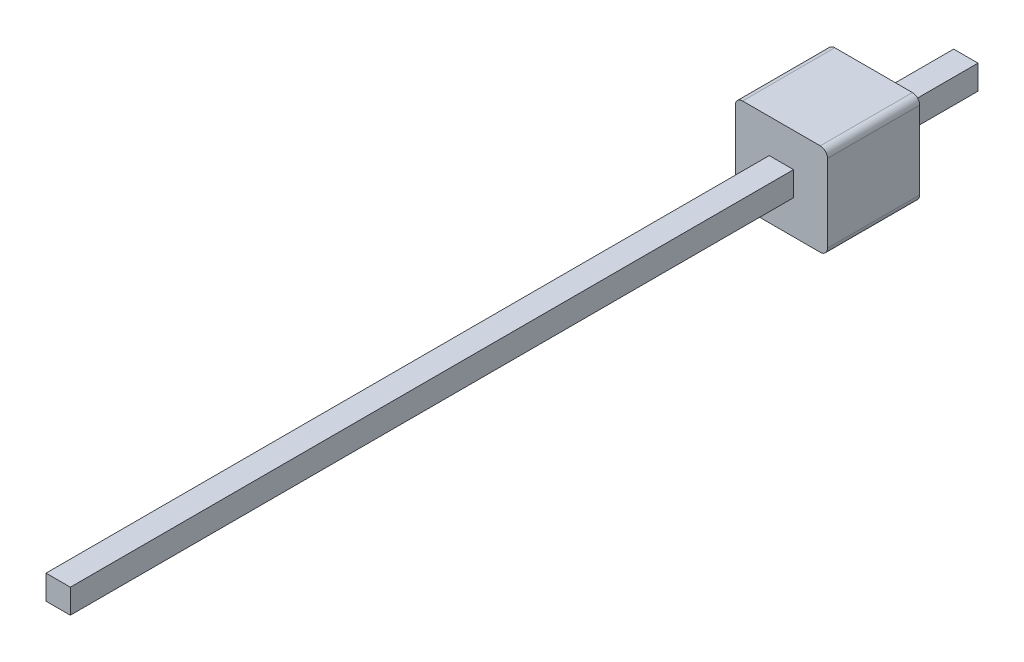
ISO-10303-21;
HEADER;
FILE_DESCRIPTION(('STEP AP214'),'2;1');
FILE_NAME('part.step','',(''),(''),'','','');
FILE_SCHEMA(('AUTOMOTIVE_DESIGN { 1 0 10303 214 1 1 1 1 }'));
ENDSEC;
DATA;
#1=APPLICATION_CONTEXT('core data for automotive mechanical design processes');
#2=APPLICATION_PROTOCOL_DEFINITION('international standard','automotive_design',2000,#1);
#3=PRODUCT_CONTEXT('',#1,'mechanical');
#4=PRODUCT('Part','Part','',(#3));
#5=PRODUCT_RELATED_PRODUCT_CATEGORY('part','',(#4));
#6=PRODUCT_DEFINITION_FORMATION('','',#4);
#7=PRODUCT_DEFINITION_CONTEXT('part definition',#1,'design');
#8=PRODUCT_DEFINITION('design','',#6,#7);
#9=PRODUCT_DEFINITION_SHAPE('','',#8);
#10=(LENGTH_UNIT() NAMED_UNIT(*) SI_UNIT(.MILLI.,.METRE.));
#11=(NAMED_UNIT(*) PLANE_ANGLE_UNIT() SI_UNIT($,.RADIAN.));
#12=(NAMED_UNIT(*) SI_UNIT($,.STERADIAN.) SOLID_ANGLE_UNIT());
#13=UNCERTAINTY_MEASURE_WITH_UNIT(LENGTH_MEASURE(1.E-05),#10,'distance_accuracy_value','');
#14=(GEOMETRIC_REPRESENTATION_CONTEXT(3) GLOBAL_UNCERTAINTY_ASSIGNED_CONTEXT((#13)) GLOBAL_UNIT_ASSIGNED_CONTEXT((#10,
#11,#12)) REPRESENTATION_CONTEXT('',''));
#15=CARTESIAN_POINT('',(0.,0.,0.));
#16=DIRECTION('',(0.,0.,1.));
#17=DIRECTION('',(1.,0.,0.));
#18=AXIS2_PLACEMENT_3D('',#15,#16,#17);
#19=CARTESIAN_POINT('',(-1.27,-1.27,2.54));
#20=DIRECTION('',(0.,0.,1.));
#21=DIRECTION('',(1.,0.,0.));
#22=AXIS2_PLACEMENT_3D('',#19,#20,#21);
#23=PLANE('',#22);
#24=DIRECTION('',(-1.,0.,0.));
#25=VECTOR('',#24,1.);
#26=CARTESIAN_POINT('',(-1.27,1.27,2.54));
#27=LINE('',#26,#25);
#28=CARTESIAN_POINT('',(1.07,1.27,2.54));
#29=VERTEX_POINT('',#28);
#30=CARTESIAN_POINT('',(-1.07,1.27,2.54));
#31=VERTEX_POINT('',#30);
#32=EDGE_CURVE('E230',#29,#31,#27,.T.);
#33=ORIENTED_EDGE('',*,*,#32,.T.);
#34=CARTESIAN_POINT('',(-1.07,1.07,2.54));
#35=DIRECTION('',(0.,0.,1.));
#36=DIRECTION('',(1.,0.,0.));
#37=AXIS2_PLACEMENT_3D('',#34,#35,#36);
#38=CIRCLE('',#37,0.2);
#39=CARTESIAN_POINT('',(-1.27,1.07,2.54));
#40=VERTEX_POINT('',#39);
#41=EDGE_CURVE('E265',#31,#40,#38,.T.);
#42=ORIENTED_EDGE('',*,*,#41,.T.);
#43=DIRECTION('',(0.,-1.,0.));
#44=VECTOR('',#43,1.);
#45=CARTESIAN_POINT('',(-1.27,1.27,2.54));
#46=LINE('',#45,#44);
#47=CARTESIAN_POINT('',(-1.27,-1.07,2.54));
#48=VERTEX_POINT('',#47);
#49=EDGE_CURVE('E222',#40,#48,#46,.T.);
#50=ORIENTED_EDGE('',*,*,#49,.T.);
#51=CARTESIAN_POINT('',(-1.07,-1.07,2.54));
#52=DIRECTION('',(0.,0.,1.));
#53=DIRECTION('',(1.,0.,0.));
#54=AXIS2_PLACEMENT_3D('',#51,#52,#53);
#55=CIRCLE('',#54,0.2);
#56=CARTESIAN_POINT('',(-1.07,-1.27,2.54));
#57=VERTEX_POINT('',#56);
#58=EDGE_CURVE('E263',#48,#57,#55,.T.);
#59=ORIENTED_EDGE('',*,*,#58,.T.);
#60=DIRECTION('',(1.,0.,0.));
#61=VECTOR('',#60,1.);
#62=CARTESIAN_POINT('',(-1.27,-1.27,2.54));
#63=LINE('',#62,#61);
#64=CARTESIAN_POINT('',(1.07,-1.27,2.54));
#65=VERTEX_POINT('',#64);
#66=EDGE_CURVE('E225',#57,#65,#63,.T.);
#67=ORIENTED_EDGE('',*,*,#66,.T.);
#68=CARTESIAN_POINT('',(1.07,-1.07,2.54));
#69=DIRECTION('',(0.,0.,1.));
#70=DIRECTION('',(1.,0.,0.));
#71=AXIS2_PLACEMENT_3D('',#68,#69,#70);
#72=CIRCLE('',#71,0.2);
#73=CARTESIAN_POINT('',(1.27,-1.07,2.54));
#74=VERTEX_POINT('',#73);
#75=EDGE_CURVE('E56',#65,#74,#72,.T.);
#76=ORIENTED_EDGE('',*,*,#75,.T.);
#77=DIRECTION('',(0.,1.,0.));
#78=VECTOR('',#77,1.);
#79=CARTESIAN_POINT('',(1.27,1.27,2.54));
#80=LINE('',#79,#78);
#81=CARTESIAN_POINT('',(1.27,1.07,2.54));
#82=VERTEX_POINT('',#81);
#83=EDGE_CURVE('E228',#74,#82,#80,.T.);
#84=ORIENTED_EDGE('',*,*,#83,.T.);
#85=CARTESIAN_POINT('',(1.07,1.07,2.54));
#86=DIRECTION('',(0.,0.,1.));
#87=DIRECTION('',(1.,0.,0.));
#88=AXIS2_PLACEMENT_3D('',#85,#86,#87);
#89=CIRCLE('',#88,0.2);
#90=EDGE_CURVE('E260',#82,#29,#89,.T.);
#91=ORIENTED_EDGE('',*,*,#90,.T.);
#92=EDGE_LOOP('',(#33,#42,#50,#59,#67,#76,#84,#91));
#93=FACE_BOUND('',#92,.T.);
#94=DIRECTION('',(0.,-1.,0.));
#95=VECTOR('',#94,1.);
#96=CARTESIAN_POINT('',(-0.335,-0.335,2.54));
#97=LINE('',#96,#95);
#98=CARTESIAN_POINT('',(-0.335,0.335,2.54));
#99=VERTEX_POINT('',#98);
#100=CARTESIAN_POINT('',(-0.335,-0.335,2.54));
#101=VERTEX_POINT('',#100);
#102=EDGE_CURVE('E165',#99,#101,#97,.T.);
#103=ORIENTED_EDGE('',*,*,#102,.F.);
#104=DIRECTION('',(-1.,0.,0.));
#105=VECTOR('',#104,1.);
#106=CARTESIAN_POINT('',(0.335,0.335,2.54));
#107=LINE('',#106,#105);
#108=CARTESIAN_POINT('',(0.335,0.335,2.54));
#109=VERTEX_POINT('',#108);
#110=EDGE_CURVE('E175',#109,#99,#107,.T.);
#111=ORIENTED_EDGE('',*,*,#110,.F.);
#112=DIRECTION('',(0.,1.,0.));
#113=VECTOR('',#112,1.);
#114=CARTESIAN_POINT('',(0.335,-0.335,2.54));
#115=LINE('',#114,#113);
#116=CARTESIAN_POINT('',(0.335,-0.335,2.54));
#117=VERTEX_POINT('',#116);
#118=EDGE_CURVE('E173',#117,#109,#115,.T.);
#119=ORIENTED_EDGE('',*,*,#118,.F.);
#120=DIRECTION('',(1.,0.,0.));
#121=VECTOR('',#120,1.);
#122=CARTESIAN_POINT('',(0.335,-0.335,2.54));
#123=LINE('',#122,#121);
#124=EDGE_CURVE('E155',#101,#117,#123,.T.);
#125=ORIENTED_EDGE('',*,*,#124,.F.);
#126=EDGE_LOOP('',(#103,#111,#119,#125));
#127=FACE_BOUND('',#126,.T.);
#128=ADVANCED_FACE('F35',(#93,#127),#23,.T.);
#129=CARTESIAN_POINT('',(-1.27,-1.27,0.));
#130=DIRECTION('',(0.,0.,1.));
#131=DIRECTION('',(1.,0.,0.));
#132=AXIS2_PLACEMENT_3D('',#129,#130,#131);
#133=PLANE('',#132);
#134=DIRECTION('',(0.,-1.,0.));
#135=VECTOR('',#134,1.);
#136=CARTESIAN_POINT('',(-1.27,1.27,0.));
#137=LINE('',#136,#135);
#138=CARTESIAN_POINT('',(-1.27,1.07,0.));
#139=VERTEX_POINT('',#138);
#140=CARTESIAN_POINT('',(-1.27,-1.07,0.));
#141=VERTEX_POINT('',#140);
#142=EDGE_CURVE('E221',#139,#141,#137,.T.);
#143=ORIENTED_EDGE('',*,*,#142,.F.);
#144=CARTESIAN_POINT('',(-1.07,1.07,0.));
#145=DIRECTION('',(0.,0.,1.));
#146=DIRECTION('',(1.,0.,0.));
#147=AXIS2_PLACEMENT_3D('',#144,#145,#146);
#148=CIRCLE('',#147,0.2);
#149=CARTESIAN_POINT('',(-1.07,1.27,0.));
#150=VERTEX_POINT('',#149);
#151=EDGE_CURVE('E253',#139,#150,#148,.F.);
#152=ORIENTED_EDGE('',*,*,#151,.T.);
#153=DIRECTION('',(-1.,0.,0.));
#154=VECTOR('',#153,1.);
#155=CARTESIAN_POINT('',(-1.27,1.27,0.));
#156=LINE('',#155,#154);
#157=CARTESIAN_POINT('',(1.07,1.27,0.));
#158=VERTEX_POINT('',#157);
#159=EDGE_CURVE('E226',#158,#150,#156,.T.);
#160=ORIENTED_EDGE('',*,*,#159,.F.);
#161=CARTESIAN_POINT('',(1.07,1.07,0.));
#162=DIRECTION('',(0.,0.,1.));
#163=DIRECTION('',(1.,0.,0.));
#164=AXIS2_PLACEMENT_3D('',#161,#162,#163);
#165=CIRCLE('',#164,0.2);
#166=CARTESIAN_POINT('',(1.27,1.07,0.));
#167=VERTEX_POINT('',#166);
#168=EDGE_CURVE('E247',#158,#167,#165,.F.);
#169=ORIENTED_EDGE('',*,*,#168,.T.);
#170=DIRECTION('',(0.,1.,0.));
#171=VECTOR('',#170,1.);
#172=CARTESIAN_POINT('',(1.27,1.27,0.));
#173=LINE('',#172,#171);
#174=CARTESIAN_POINT('',(1.27,-1.07,0.));
#175=VERTEX_POINT('',#174);
#176=EDGE_CURVE('E239',#175,#167,#173,.T.);
#177=ORIENTED_EDGE('',*,*,#176,.F.);
#178=CARTESIAN_POINT('',(1.07,-1.07,0.));
#179=DIRECTION('',(0.,0.,1.));
#180=DIRECTION('',(1.,0.,0.));
#181=AXIS2_PLACEMENT_3D('',#178,#179,#180);
#182=CIRCLE('',#181,0.2);
#183=CARTESIAN_POINT('',(1.07,-1.27,0.));
#184=VERTEX_POINT('',#183);
#185=EDGE_CURVE('E249',#175,#184,#182,.F.);
#186=ORIENTED_EDGE('',*,*,#185,.T.);
#187=DIRECTION('',(1.,0.,0.));
#188=VECTOR('',#187,1.);
#189=CARTESIAN_POINT('',(-1.27,-1.27,0.));
#190=LINE('',#189,#188);
#191=CARTESIAN_POINT('',(-1.07,-1.27,0.));
#192=VERTEX_POINT('',#191);
#193=EDGE_CURVE('E236',#192,#184,#190,.T.);
#194=ORIENTED_EDGE('',*,*,#193,.F.);
#195=CARTESIAN_POINT('',(-1.07,-1.07,0.));
#196=DIRECTION('',(0.,0.,1.));
#197=DIRECTION('',(1.,0.,0.));
#198=AXIS2_PLACEMENT_3D('',#195,#196,#197);
#199=CIRCLE('',#198,0.2);
#200=EDGE_CURVE('E251',#192,#141,#199,.F.);
#201=ORIENTED_EDGE('',*,*,#200,.T.);
#202=EDGE_LOOP('',(#143,#152,#160,#169,#177,#186,#194,#201));
#203=FACE_BOUND('',#202,.T.);
#204=DIRECTION('',(0.,-1.,0.));
#205=VECTOR('',#204,1.);
#206=CARTESIAN_POINT('',(0.335,-0.335,0.));
#207=LINE('',#206,#205);
#208=CARTESIAN_POINT('',(0.335,0.335,0.));
#209=VERTEX_POINT('',#208);
#210=CARTESIAN_POINT('',(0.335,-0.335,0.));
#211=VERTEX_POINT('',#210);
#212=EDGE_CURVE('E198',#209,#211,#207,.T.);
#213=ORIENTED_EDGE('',*,*,#212,.F.);
#214=DIRECTION('',(1.,0.,0.));
#215=VECTOR('',#214,1.);
#216=CARTESIAN_POINT('',(-0.335,0.335,0.));
#217=LINE('',#216,#215);
#218=CARTESIAN_POINT('',(-0.335,0.335,0.));
#219=VERTEX_POINT('',#218);
#220=EDGE_CURVE('E191',#219,#209,#217,.T.);
#221=ORIENTED_EDGE('',*,*,#220,.F.);
#222=DIRECTION('',(0.,1.,0.));
#223=VECTOR('',#222,1.);
#224=CARTESIAN_POINT('',(-0.335,-0.335,0.));
#225=LINE('',#224,#223);
#226=CARTESIAN_POINT('',(-0.335,-0.335,0.));
#227=VERTEX_POINT('',#226);
#228=EDGE_CURVE('E205',#227,#219,#225,.T.);
#229=ORIENTED_EDGE('',*,*,#228,.F.);
#230=DIRECTION('',(-1.,0.,0.));
#231=VECTOR('',#230,1.);
#232=CARTESIAN_POINT('',(-0.335,-0.335,0.));
#233=LINE('',#232,#231);
#234=EDGE_CURVE('E201',#211,#227,#233,.T.);
#235=ORIENTED_EDGE('',*,*,#234,.F.);
#236=EDGE_LOOP('',(#213,#221,#229,#235));
#237=FACE_BOUND('',#236,.T.);
#238=ADVANCED_FACE('F281',(#203,#237),#133,.F.);
#239=CARTESIAN_POINT('',(-1.27,1.27,2.54));
#240=DIRECTION('',(1.,0.,0.));
#241=DIRECTION('',(0.,0.,-1.));
#242=AXIS2_PLACEMENT_3D('',#239,#240,#241);
#243=PLANE('',#242);
#244=ORIENTED_EDGE('',*,*,#49,.F.);
#245=DIRECTION('',(0.,0.,-1.));
#246=VECTOR('',#245,1.);
#247=CARTESIAN_POINT('',(-1.27,1.07,2.54));
#248=LINE('',#247,#246);
#249=EDGE_CURVE('E244',#40,#139,#248,.T.);
#250=ORIENTED_EDGE('',*,*,#249,.T.);
#251=ORIENTED_EDGE('',*,*,#142,.T.);
#252=DIRECTION('',(0.,0.,-1.));
#253=VECTOR('',#252,1.);
#254=CARTESIAN_POINT('',(-1.27,-1.07,2.54));
#255=LINE('',#254,#253);
#256=EDGE_CURVE('E233',#141,#48,#255,.F.);
#257=ORIENTED_EDGE('',*,*,#256,.T.);
#258=EDGE_LOOP('',(#244,#250,#251,#257));
#259=FACE_BOUND('',#258,.T.);
#260=ADVANCED_FACE('F302',(#259),#243,.F.);
#261=CARTESIAN_POINT('',(-1.27,-1.27,2.54));
#262=DIRECTION('',(0.,1.,0.));
#263=DIRECTION('',(-1.,0.,0.));
#264=AXIS2_PLACEMENT_3D('',#261,#262,#263);
#265=PLANE('',#264);
#266=ORIENTED_EDGE('',*,*,#66,.F.);
#267=DIRECTION('',(0.,0.,-1.));
#268=VECTOR('',#267,1.);
#269=CARTESIAN_POINT('',(-1.07,-1.27,2.54));
#270=LINE('',#269,#268);
#271=EDGE_CURVE('E269',#57,#192,#270,.T.);
#272=ORIENTED_EDGE('',*,*,#271,.T.);
#273=ORIENTED_EDGE('',*,*,#193,.T.);
#274=DIRECTION('',(0.,0.,-1.));
#275=VECTOR('',#274,1.);
#276=CARTESIAN_POINT('',(1.07,-1.27,2.54));
#277=LINE('',#276,#275);
#278=EDGE_CURVE('E267',#184,#65,#277,.F.);
#279=ORIENTED_EDGE('',*,*,#278,.T.);
#280=EDGE_LOOP('',(#266,#272,#273,#279));
#281=FACE_BOUND('',#280,.T.);
#282=ADVANCED_FACE('F275',(#281),#265,.F.);
#283=CARTESIAN_POINT('',(1.27,1.27,2.54));
#284=DIRECTION('',(-1.,0.,0.));
#285=DIRECTION('',(0.,-1.,0.));
#286=AXIS2_PLACEMENT_3D('',#283,#284,#285);
#287=PLANE('',#286);
#288=ORIENTED_EDGE('',*,*,#83,.F.);
#289=DIRECTION('',(0.,0.,-1.));
#290=VECTOR('',#289,1.);
#291=CARTESIAN_POINT('',(1.27,-1.07,2.54));
#292=LINE('',#291,#290);
#293=EDGE_CURVE('E12',#74,#175,#292,.T.);
#294=ORIENTED_EDGE('',*,*,#293,.T.);
#295=ORIENTED_EDGE('',*,*,#176,.T.);
#296=DIRECTION('',(0.,0.,-1.));
#297=VECTOR('',#296,1.);
#298=CARTESIAN_POINT('',(1.27,1.07,2.54));
#299=LINE('',#298,#297);
#300=EDGE_CURVE('E43',#167,#82,#299,.F.);
#301=ORIENTED_EDGE('',*,*,#300,.T.);
#302=EDGE_LOOP('',(#288,#294,#295,#301));
#303=FACE_BOUND('',#302,.T.);
#304=ADVANCED_FACE('F287',(#303),#287,.F.);
#305=CARTESIAN_POINT('',(-1.27,1.27,2.54));
#306=DIRECTION('',(0.,-1.,0.));
#307=DIRECTION('',(1.,0.,0.));
#308=AXIS2_PLACEMENT_3D('',#305,#306,#307);
#309=PLANE('',#308);
#310=ORIENTED_EDGE('',*,*,#159,.T.);
#311=DIRECTION('',(0.,0.,-1.));
#312=VECTOR('',#311,1.);
#313=CARTESIAN_POINT('',(-1.07,1.27,2.54));
#314=LINE('',#313,#312);
#315=EDGE_CURVE('E258',#150,#31,#314,.F.);
#316=ORIENTED_EDGE('',*,*,#315,.T.);
#317=ORIENTED_EDGE('',*,*,#32,.F.);
#318=DIRECTION('',(0.,0.,-1.));
#319=VECTOR('',#318,1.);
#320=CARTESIAN_POINT('',(1.07,1.27,2.54));
#321=LINE('',#320,#319);
#322=EDGE_CURVE('E255',#29,#158,#321,.T.);
#323=ORIENTED_EDGE('',*,*,#322,.T.);
#324=EDGE_LOOP('',(#310,#316,#317,#323));
#325=FACE_BOUND('',#324,.T.);
#326=ADVANCED_FACE('F294',(#325),#309,.F.);
#327=CARTESIAN_POINT('',(0.335,-0.335,-2.54));
#328=DIRECTION('',(-1.,0.,0.));
#329=DIRECTION('',(0.,0.,1.));
#330=AXIS2_PLACEMENT_3D('',#327,#328,#329);
#331=PLANE('',#330);
#332=ORIENTED_EDGE('',*,*,#212,.T.);
#333=DIRECTION('',(0.,0.,1.));
#334=VECTOR('',#333,1.);
#335=CARTESIAN_POINT('',(0.335,-0.335,-2.54));
#336=LINE('',#335,#334);
#337=CARTESIAN_POINT('',(0.335,-0.335,-2.54));
#338=VERTEX_POINT('',#337);
#339=EDGE_CURVE('E218',#338,#211,#336,.T.);
#340=ORIENTED_EDGE('',*,*,#339,.F.);
#341=DIRECTION('',(0.,-1.,0.));
#342=VECTOR('',#341,1.);
#343=CARTESIAN_POINT('',(0.335,-0.335,-2.54));
#344=LINE('',#343,#342);
#345=CARTESIAN_POINT('',(0.335,0.335,-2.54));
#346=VERTEX_POINT('',#345);
#347=EDGE_CURVE('E187',#346,#338,#344,.T.);
#348=ORIENTED_EDGE('',*,*,#347,.F.);
#349=DIRECTION('',(0.,0.,1.));
#350=VECTOR('',#349,1.);
#351=CARTESIAN_POINT('',(0.335,0.335,-2.54));
#352=LINE('',#351,#350);
#353=EDGE_CURVE('E197',#346,#209,#352,.T.);
#354=ORIENTED_EDGE('',*,*,#353,.T.);
#355=EDGE_LOOP('',(#332,#340,#348,#354));
#356=FACE_BOUND('',#355,.T.);
#357=ADVANCED_FACE('F321',(#356),#331,.F.);
#358=CARTESIAN_POINT('',(-0.335,-0.335,-2.54));
#359=DIRECTION('',(0.,1.,0.));
#360=DIRECTION('',(-1.,0.,0.));
#361=AXIS2_PLACEMENT_3D('',#358,#359,#360);
#362=PLANE('',#361);
#363=ORIENTED_EDGE('',*,*,#234,.T.);
#364=DIRECTION('',(0.,0.,1.));
#365=VECTOR('',#364,1.);
#366=CARTESIAN_POINT('',(-0.335,-0.335,-2.54));
#367=LINE('',#366,#365);
#368=CARTESIAN_POINT('',(-0.335,-0.335,-2.54));
#369=VERTEX_POINT('',#368);
#370=EDGE_CURVE('E215',#369,#227,#367,.T.);
#371=ORIENTED_EDGE('',*,*,#370,.F.);
#372=DIRECTION('',(-1.,0.,0.));
#373=VECTOR('',#372,1.);
#374=CARTESIAN_POINT('',(-0.335,-0.335,-2.54));
#375=LINE('',#374,#373);
#376=EDGE_CURVE('E190',#338,#369,#375,.T.);
#377=ORIENTED_EDGE('',*,*,#376,.F.);
#378=ORIENTED_EDGE('',*,*,#339,.T.);
#379=EDGE_LOOP('',(#363,#371,#377,#378));
#380=FACE_BOUND('',#379,.T.);
#381=ADVANCED_FACE('F428',(#380),#362,.F.);
#382=CARTESIAN_POINT('',(-0.335,-0.335,-2.54));
#383=DIRECTION('',(1.,0.,0.));
#384=DIRECTION('',(0.,0.,-1.));
#385=AXIS2_PLACEMENT_3D('',#382,#383,#384);
#386=PLANE('',#385);
#387=ORIENTED_EDGE('',*,*,#228,.T.);
#388=DIRECTION('',(0.,0.,1.));
#389=VECTOR('',#388,1.);
#390=CARTESIAN_POINT('',(-0.335,0.335,-2.54));
#391=LINE('',#390,#389);
#392=CARTESIAN_POINT('',(-0.335,0.335,-2.54));
#393=VERTEX_POINT('',#392);
#394=EDGE_CURVE('E212',#393,#219,#391,.T.);
#395=ORIENTED_EDGE('',*,*,#394,.F.);
#396=DIRECTION('',(0.,1.,0.));
#397=VECTOR('',#396,1.);
#398=CARTESIAN_POINT('',(-0.335,-0.335,-2.54));
#399=LINE('',#398,#397);
#400=EDGE_CURVE('E193',#369,#393,#399,.T.);
#401=ORIENTED_EDGE('',*,*,#400,.F.);
#402=ORIENTED_EDGE('',*,*,#370,.T.);
#403=EDGE_LOOP('',(#387,#395,#401,#402));
#404=FACE_BOUND('',#403,.T.);
#405=ADVANCED_FACE('F420',(#404),#386,.F.);
#406=CARTESIAN_POINT('',(-0.335,0.335,-2.54));
#407=DIRECTION('',(0.,-1.,0.));
#408=DIRECTION('',(1.,0.,0.));
#409=AXIS2_PLACEMENT_3D('',#406,#407,#408);
#410=PLANE('',#409);
#411=ORIENTED_EDGE('',*,*,#220,.T.);
#412=ORIENTED_EDGE('',*,*,#353,.F.);
#413=DIRECTION('',(1.,0.,0.));
#414=VECTOR('',#413,1.);
#415=CARTESIAN_POINT('',(-0.335,0.335,-2.54));
#416=LINE('',#415,#414);
#417=EDGE_CURVE('E195',#393,#346,#416,.T.);
#418=ORIENTED_EDGE('',*,*,#417,.F.);
#419=ORIENTED_EDGE('',*,*,#394,.T.);
#420=EDGE_LOOP('',(#411,#412,#418,#419));
#421=FACE_BOUND('',#420,.T.);
#422=ADVANCED_FACE('F412',(#421),#410,.F.);
#423=CARTESIAN_POINT('',(0.,0.,-2.54));
#424=DIRECTION('',(0.,0.,-1.));
#425=DIRECTION('',(-1.,0.,0.));
#426=AXIS2_PLACEMENT_3D('',#423,#424,#425);
#427=PLANE('',#426);
#428=ORIENTED_EDGE('',*,*,#347,.T.);
#429=ORIENTED_EDGE('',*,*,#376,.T.);
#430=ORIENTED_EDGE('',*,*,#400,.T.);
#431=ORIENTED_EDGE('',*,*,#417,.T.);
#432=EDGE_LOOP('',(#428,#429,#430,#431));
#433=FACE_BOUND('',#432,.T.);
#434=ADVANCED_FACE('F404',(#433),#427,.T.);
#435=CARTESIAN_POINT('',(0.335,0.335,48.40752308679));
#436=DIRECTION('',(0.,-1.,0.));
#437=DIRECTION('',(1.,0.,0.));
#438=AXIS2_PLACEMENT_3D('',#435,#436,#437);
#439=PLANE('',#438);
#440=DIRECTION('',(0.,0.,-1.));
#441=VECTOR('',#440,1.);
#442=CARTESIAN_POINT('',(-0.335,0.335,48.40752308679));
#443=LINE('',#442,#441);
#444=CARTESIAN_POINT('',(-0.335,0.335,22.46));
#445=VERTEX_POINT('',#444);
#446=EDGE_CURVE('E168',#445,#99,#443,.T.);
#447=ORIENTED_EDGE('',*,*,#446,.F.);
#448=DIRECTION('',(1.,0.,0.));
#449=VECTOR('',#448,1.);
#450=CARTESIAN_POINT('',(0.335,0.335,22.46));
#451=LINE('',#450,#449);
#452=CARTESIAN_POINT('',(0.335,0.335,22.46));
#453=VERTEX_POINT('',#452);
#454=EDGE_CURVE('E160',#445,#453,#451,.T.);
#455=ORIENTED_EDGE('',*,*,#454,.T.);
#456=DIRECTION('',(0.,0.,-1.));
#457=VECTOR('',#456,1.);
#458=CARTESIAN_POINT('',(0.335,0.335,48.40752308679));
#459=LINE('',#458,#457);
#460=EDGE_CURVE('E181',#453,#109,#459,.T.);
#461=ORIENTED_EDGE('',*,*,#460,.T.);
#462=ORIENTED_EDGE('',*,*,#110,.T.);
#463=EDGE_LOOP('',(#447,#455,#461,#462));
#464=FACE_BOUND('',#463,.T.);
#465=ADVANCED_FACE('F396',(#464),#439,.F.);
#466=CARTESIAN_POINT('',(0.335,-0.335,48.40752308679));
#467=DIRECTION('',(-1.,0.,0.));
#468=DIRECTION('',(0.,0.,1.));
#469=AXIS2_PLACEMENT_3D('',#466,#467,#468);
#470=PLANE('',#469);
#471=ORIENTED_EDGE('',*,*,#460,.F.);
#472=DIRECTION('',(0.,-1.,0.));
#473=VECTOR('',#472,1.);
#474=CARTESIAN_POINT('',(0.335,-0.335,22.46));
#475=LINE('',#474,#473);
#476=CARTESIAN_POINT('',(0.335,-0.335,22.46));
#477=VERTEX_POINT('',#476);
#478=EDGE_CURVE('E186',#453,#477,#475,.T.);
#479=ORIENTED_EDGE('',*,*,#478,.T.);
#480=DIRECTION('',(0.,0.,-1.));
#481=VECTOR('',#480,1.);
#482=CARTESIAN_POINT('',(0.335,-0.335,48.40752308679));
#483=LINE('',#482,#481);
#484=EDGE_CURVE('E161',#477,#117,#483,.T.);
#485=ORIENTED_EDGE('',*,*,#484,.T.);
#486=ORIENTED_EDGE('',*,*,#118,.T.);
#487=EDGE_LOOP('',(#471,#479,#485,#486));
#488=FACE_BOUND('',#487,.T.);
#489=ADVANCED_FACE('F389',(#488),#470,.F.);
#490=CARTESIAN_POINT('',(0.335,-0.335,48.40752308679));
#491=DIRECTION('',(0.,1.,0.));
#492=DIRECTION('',(-1.,0.,0.));
#493=AXIS2_PLACEMENT_3D('',#490,#491,#492);
#494=PLANE('',#493);
#495=ORIENTED_EDGE('',*,*,#484,.F.);
#496=DIRECTION('',(-1.,0.,0.));
#497=VECTOR('',#496,1.);
#498=CARTESIAN_POINT('',(0.335,-0.335,22.46));
#499=LINE('',#498,#497);
#500=CARTESIAN_POINT('',(-0.335,-0.335,22.46));
#501=VERTEX_POINT('',#500);
#502=EDGE_CURVE('E157',#477,#501,#499,.T.);
#503=ORIENTED_EDGE('',*,*,#502,.T.);
#504=DIRECTION('',(0.,0.,-1.));
#505=VECTOR('',#504,1.);
#506=CARTESIAN_POINT('',(-0.335,-0.335,48.40752308679));
#507=LINE('',#506,#505);
#508=EDGE_CURVE('E150',#501,#101,#507,.T.);
#509=ORIENTED_EDGE('',*,*,#508,.T.);
#510=ORIENTED_EDGE('',*,*,#124,.T.);
#511=EDGE_LOOP('',(#495,#503,#509,#510));
#512=FACE_BOUND('',#511,.T.);
#513=ADVANCED_FACE('F153',(#512),#494,.F.);
#514=CARTESIAN_POINT('',(-0.335,-0.335,48.40752308679));
#515=DIRECTION('',(1.,0.,0.));
#516=DIRECTION('',(0.,0.,-1.));
#517=AXIS2_PLACEMENT_3D('',#514,#515,#516);
#518=PLANE('',#517);
#519=ORIENTED_EDGE('',*,*,#508,.F.);
#520=DIRECTION('',(0.,1.,0.));
#521=VECTOR('',#520,1.);
#522=CARTESIAN_POINT('',(-0.335,-0.335,22.46));
#523=LINE('',#522,#521);
#524=EDGE_CURVE('E202',#501,#445,#523,.T.);
#525=ORIENTED_EDGE('',*,*,#524,.T.);
#526=ORIENTED_EDGE('',*,*,#446,.T.);
#527=ORIENTED_EDGE('',*,*,#102,.T.);
#528=EDGE_LOOP('',(#519,#525,#526,#527));
#529=FACE_BOUND('',#528,.T.);
#530=ADVANCED_FACE('F166',(#529),#518,.F.);
#531=CARTESIAN_POINT('',(0.,0.,22.46));
#532=DIRECTION('',(0.,0.,-1.));
#533=DIRECTION('',(-1.,0.,0.));
#534=AXIS2_PLACEMENT_3D('',#531,#532,#533);
#535=PLANE('',#534);
#536=ORIENTED_EDGE('',*,*,#502,.F.);
#537=ORIENTED_EDGE('',*,*,#478,.F.);
#538=ORIENTED_EDGE('',*,*,#454,.F.);
#539=ORIENTED_EDGE('',*,*,#524,.F.);
#540=EDGE_LOOP('',(#536,#537,#538,#539));
#541=FACE_BOUND('',#540,.T.);
#542=ADVANCED_FACE('F311',(#541),#535,.F.);
#543=CARTESIAN_POINT('',(-1.07,1.07,2.54));
#544=DIRECTION('',(0.,0.,-1.));
#545=DIRECTION('',(-1.,0.,0.));
#546=AXIS2_PLACEMENT_3D('',#543,#544,#545);
#547=CYLINDRICAL_SURFACE('',#546,0.2);
#548=ORIENTED_EDGE('',*,*,#41,.F.);
#549=ORIENTED_EDGE('',*,*,#315,.F.);
#550=ORIENTED_EDGE('',*,*,#151,.F.);
#551=ORIENTED_EDGE('',*,*,#249,.F.);
#552=EDGE_LOOP('',(#548,#549,#550,#551));
#553=FACE_BOUND('',#552,.T.);
#554=ADVANCED_FACE('F299',(#553),#547,.T.);
#555=CARTESIAN_POINT('',(-1.07,-1.07,2.54));
#556=DIRECTION('',(0.,0.,-1.));
#557=DIRECTION('',(-1.,0.,0.));
#558=AXIS2_PLACEMENT_3D('',#555,#556,#557);
#559=CYLINDRICAL_SURFACE('',#558,0.2);
#560=ORIENTED_EDGE('',*,*,#58,.F.);
#561=ORIENTED_EDGE('',*,*,#256,.F.);
#562=ORIENTED_EDGE('',*,*,#200,.F.);
#563=ORIENTED_EDGE('',*,*,#271,.F.);
#564=EDGE_LOOP('',(#560,#561,#562,#563));
#565=FACE_BOUND('',#564,.T.);
#566=ADVANCED_FACE('F304',(#565),#559,.T.);
#567=CARTESIAN_POINT('',(1.07,-1.07,2.54));
#568=DIRECTION('',(0.,0.,-1.));
#569=DIRECTION('',(-1.,0.,0.));
#570=AXIS2_PLACEMENT_3D('',#567,#568,#569);
#571=CYLINDRICAL_SURFACE('',#570,0.2);
#572=ORIENTED_EDGE('',*,*,#75,.F.);
#573=ORIENTED_EDGE('',*,*,#278,.F.);
#574=ORIENTED_EDGE('',*,*,#185,.F.);
#575=ORIENTED_EDGE('',*,*,#293,.F.);
#576=EDGE_LOOP('',(#572,#573,#574,#575));
#577=FACE_BOUND('',#576,.T.);
#578=ADVANCED_FACE('F286',(#577),#571,.T.);
#579=CARTESIAN_POINT('',(1.07,1.07,2.54));
#580=DIRECTION('',(0.,0.,-1.));
#581=DIRECTION('',(-1.,0.,0.));
#582=AXIS2_PLACEMENT_3D('',#579,#580,#581);
#583=CYLINDRICAL_SURFACE('',#582,0.2);
#584=ORIENTED_EDGE('',*,*,#90,.F.);
#585=ORIENTED_EDGE('',*,*,#300,.F.);
#586=ORIENTED_EDGE('',*,*,#168,.F.);
#587=ORIENTED_EDGE('',*,*,#322,.F.);
#588=EDGE_LOOP('',(#584,#585,#586,#587));
#589=FACE_BOUND('',#588,.T.);
#590=ADVANCED_FACE('F37',(#589),#583,.T.);
#591=CLOSED_SHELL('',(#128,#238,#260,#282,#304,#326,#357,#381,#405,#422,#434,#465,#489,#513,
#530,#542,#554,#566,#578,#590));
#592=MANIFOLD_SOLID_BREP('B2',#591);
#593=ADVANCED_BREP_SHAPE_REPRESENTATION('',(#18,#592),#14);
#594=SHAPE_DEFINITION_REPRESENTATION(#9,#593);
ENDSEC;
END-ISO-10303-21;
